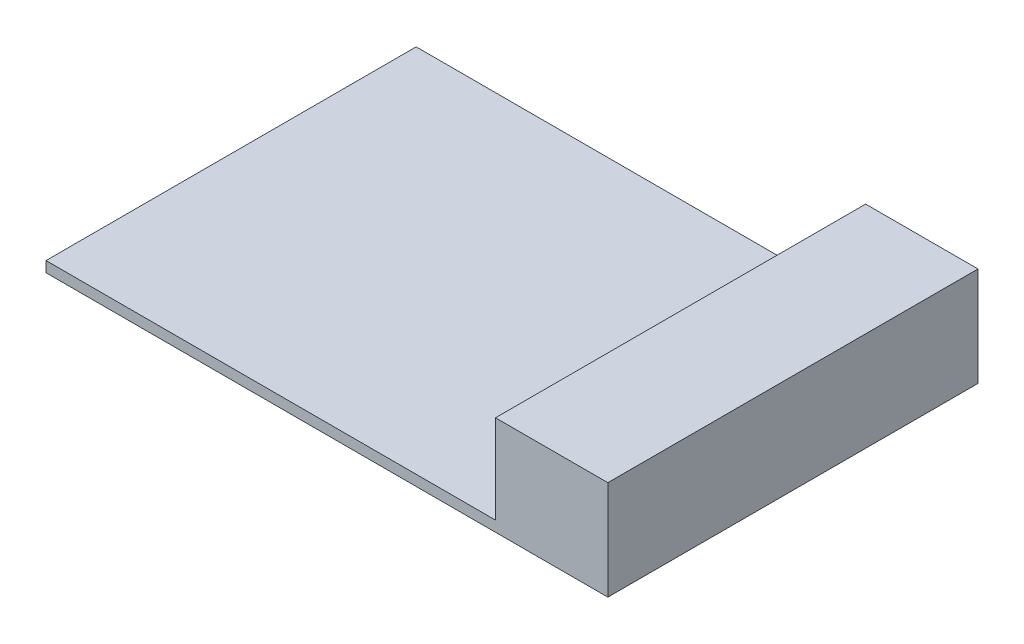
ISO-10303-21;
HEADER;
FILE_DESCRIPTION(('STEP AP214'),'2;1');
FILE_NAME('part.step','',(''),(''),'','','');
FILE_SCHEMA(('AUTOMOTIVE_DESIGN { 1 0 10303 214 1 1 1 1 }'));
ENDSEC;
DATA;
#1=APPLICATION_CONTEXT('core data for automotive mechanical design processes');
#2=APPLICATION_PROTOCOL_DEFINITION('international standard','automotive_design',2000,#1);
#3=PRODUCT_CONTEXT('',#1,'mechanical');
#4=PRODUCT('Part','Part','',(#3));
#5=PRODUCT_RELATED_PRODUCT_CATEGORY('part','',(#4));
#6=PRODUCT_DEFINITION_FORMATION('','',#4);
#7=PRODUCT_DEFINITION_CONTEXT('part definition',#1,'design');
#8=PRODUCT_DEFINITION('design','',#6,#7);
#9=PRODUCT_DEFINITION_SHAPE('','',#8);
#10=(LENGTH_UNIT() NAMED_UNIT(*) SI_UNIT(.MILLI.,.METRE.));
#11=(NAMED_UNIT(*) PLANE_ANGLE_UNIT() SI_UNIT($,.RADIAN.));
#12=(NAMED_UNIT(*) SI_UNIT($,.STERADIAN.) SOLID_ANGLE_UNIT());
#13=UNCERTAINTY_MEASURE_WITH_UNIT(LENGTH_MEASURE(1.E-05),#10,'distance_accuracy_value','');
#14=(GEOMETRIC_REPRESENTATION_CONTEXT(3) GLOBAL_UNCERTAINTY_ASSIGNED_CONTEXT((#13)) GLOBAL_UNIT_ASSIGNED_CONTEXT((#10,
#11,#12)) REPRESENTATION_CONTEXT('',''));
#15=CARTESIAN_POINT('',(0.,0.,0.));
#16=DIRECTION('',(0.,0.,1.));
#17=DIRECTION('',(1.,0.,0.));
#18=AXIS2_PLACEMENT_3D('',#15,#16,#17);
#19=CARTESIAN_POINT('',(0.,1.6,0.));
#20=DIRECTION('',(0.,1.,0.));
#21=DIRECTION('',(0.,0.,1.));
#22=AXIS2_PLACEMENT_3D('',#19,#20,#21);
#23=PLANE('',#22);
#24=DIRECTION('',(1.,0.,0.));
#25=VECTOR('',#24,1.);
#26=CARTESIAN_POINT('',(-42.5,1.6,28.));
#27=LINE('',#26,#25);
#28=CARTESIAN_POINT('',(-42.5,1.6,28.));
#29=VERTEX_POINT('',#28);
#30=CARTESIAN_POINT('',(25.5,1.6,28.));
#31=VERTEX_POINT('',#30);
#32=EDGE_CURVE('E117',#29,#31,#27,.T.);
#33=ORIENTED_EDGE('',*,*,#32,.T.);
#34=DIRECTION('',(0.,0.,-1.));
#35=VECTOR('',#34,1.);
#36=CARTESIAN_POINT('',(25.5,1.6,0.));
#37=LINE('',#36,#35);
#38=CARTESIAN_POINT('',(25.5,1.6,-28.));
#39=VERTEX_POINT('',#38);
#40=EDGE_CURVE('E11',#31,#39,#37,.T.);
#41=ORIENTED_EDGE('',*,*,#40,.T.);
#42=DIRECTION('',(-1.,0.,0.));
#43=VECTOR('',#42,1.);
#44=CARTESIAN_POINT('',(42.5,1.6,-28.));
#45=LINE('',#44,#43);
#46=CARTESIAN_POINT('',(-42.5,1.6,-28.));
#47=VERTEX_POINT('',#46);
#48=EDGE_CURVE('E62',#39,#47,#45,.T.);
#49=ORIENTED_EDGE('',*,*,#48,.T.);
#50=DIRECTION('',(0.,0.,1.));
#51=VECTOR('',#50,1.);
#52=CARTESIAN_POINT('',(-42.5,1.6,-28.));
#53=LINE('',#52,#51);
#54=EDGE_CURVE('E95',#47,#29,#53,.T.);
#55=ORIENTED_EDGE('',*,*,#54,.T.);
#56=EDGE_LOOP('',(#33,#41,#49,#55));
#57=FACE_BOUND('',#56,.T.);
#58=ADVANCED_FACE('F39',(#57),#23,.T.);
#59=CARTESIAN_POINT('',(-42.5,1.6,-28.));
#60=DIRECTION('',(1.,0.,0.));
#61=DIRECTION('',(0.,0.,-1.));
#62=AXIS2_PLACEMENT_3D('',#59,#60,#61);
#63=PLANE('',#62);
#64=DIRECTION('',(0.,0.,1.));
#65=VECTOR('',#64,1.);
#66=CARTESIAN_POINT('',(-42.5,0.,-28.));
#67=LINE('',#66,#65);
#68=CARTESIAN_POINT('',(-42.5,0.,-28.));
#69=VERTEX_POINT('',#68);
#70=CARTESIAN_POINT('',(-42.5,0.,28.));
#71=VERTEX_POINT('',#70);
#72=EDGE_CURVE('E98',#69,#71,#67,.T.);
#73=ORIENTED_EDGE('',*,*,#72,.T.);
#74=DIRECTION('',(0.,-1.,0.));
#75=VECTOR('',#74,1.);
#76=CARTESIAN_POINT('',(-42.5,1.6,28.));
#77=LINE('',#76,#75);
#78=EDGE_CURVE('E50',#29,#71,#77,.T.);
#79=ORIENTED_EDGE('',*,*,#78,.F.);
#80=ORIENTED_EDGE('',*,*,#54,.F.);
#81=DIRECTION('',(0.,-1.,0.));
#82=VECTOR('',#81,1.);
#83=CARTESIAN_POINT('',(-42.5,1.6,-28.));
#84=LINE('',#83,#82);
#85=EDGE_CURVE('E85',#47,#69,#84,.T.);
#86=ORIENTED_EDGE('',*,*,#85,.T.);
#87=EDGE_LOOP('',(#73,#79,#80,#86));
#88=FACE_BOUND('',#87,.T.);
#89=ADVANCED_FACE('F41',(#88),#63,.F.);
#90=CARTESIAN_POINT('',(-42.5,1.6,28.));
#91=DIRECTION('',(0.,0.,-1.));
#92=DIRECTION('',(-1.,0.,0.));
#93=AXIS2_PLACEMENT_3D('',#90,#91,#92);
#94=PLANE('',#93);
#95=DIRECTION('',(0.,-1.,0.));
#96=VECTOR('',#95,1.);
#97=CARTESIAN_POINT('',(42.5,1.6,28.));
#98=LINE('',#97,#96);
#99=CARTESIAN_POINT('',(42.5,15.,28.));
#100=VERTEX_POINT('',#99);
#101=CARTESIAN_POINT('',(42.5,0.,28.));
#102=VERTEX_POINT('',#101);
#103=EDGE_CURVE('E114',#100,#102,#98,.T.);
#104=ORIENTED_EDGE('',*,*,#103,.F.);
#105=DIRECTION('',(1.,0.,0.));
#106=VECTOR('',#105,1.);
#107=CARTESIAN_POINT('',(25.5,15.,28.));
#108=LINE('',#107,#106);
#109=CARTESIAN_POINT('',(25.5,15.,28.));
#110=VERTEX_POINT('',#109);
#111=EDGE_CURVE('E133',#110,#100,#108,.T.);
#112=ORIENTED_EDGE('',*,*,#111,.F.);
#113=DIRECTION('',(0.,-1.,0.));
#114=VECTOR('',#113,1.);
#115=CARTESIAN_POINT('',(25.5,15.,28.));
#116=LINE('',#115,#114);
#117=EDGE_CURVE('E102',#110,#31,#116,.T.);
#118=ORIENTED_EDGE('',*,*,#117,.T.);
#119=ORIENTED_EDGE('',*,*,#32,.F.);
#120=ORIENTED_EDGE('',*,*,#78,.T.);
#121=DIRECTION('',(1.,0.,0.));
#122=VECTOR('',#121,1.);
#123=CARTESIAN_POINT('',(-42.5,0.,28.));
#124=LINE('',#123,#122);
#125=EDGE_CURVE('E101',#71,#102,#124,.T.);
#126=ORIENTED_EDGE('',*,*,#125,.T.);
#127=EDGE_LOOP('',(#104,#112,#118,#119,#120,#126));
#128=FACE_BOUND('',#127,.T.);
#129=ADVANCED_FACE('F120',(#128),#94,.F.);
#130=CARTESIAN_POINT('',(42.5,1.6,28.));
#131=DIRECTION('',(-1.,0.,0.));
#132=DIRECTION('',(0.,0.,1.));
#133=AXIS2_PLACEMENT_3D('',#130,#131,#132);
#134=PLANE('',#133);
#135=DIRECTION('',(0.,0.,-1.));
#136=VECTOR('',#135,1.);
#137=CARTESIAN_POINT('',(42.5,0.,28.));
#138=LINE('',#137,#136);
#139=CARTESIAN_POINT('',(42.5,0.,-28.));
#140=VERTEX_POINT('',#139);
#141=EDGE_CURVE('E93',#102,#140,#138,.T.);
#142=ORIENTED_EDGE('',*,*,#141,.T.);
#143=DIRECTION('',(0.,-1.,0.));
#144=VECTOR('',#143,1.);
#145=CARTESIAN_POINT('',(42.5,1.6,-28.));
#146=LINE('',#145,#144);
#147=CARTESIAN_POINT('',(42.5,15.,-28.));
#148=VERTEX_POINT('',#147);
#149=EDGE_CURVE('E86',#148,#140,#146,.T.);
#150=ORIENTED_EDGE('',*,*,#149,.F.);
#151=DIRECTION('',(0.,0.,-1.));
#152=VECTOR('',#151,1.);
#153=CARTESIAN_POINT('',(42.5,15.,28.));
#154=LINE('',#153,#152);
#155=EDGE_CURVE('E126',#100,#148,#154,.T.);
#156=ORIENTED_EDGE('',*,*,#155,.F.);
#157=ORIENTED_EDGE('',*,*,#103,.T.);
#158=EDGE_LOOP('',(#142,#150,#156,#157));
#159=FACE_BOUND('',#158,.T.);
#160=ADVANCED_FACE('F147',(#159),#134,.F.);
#161=CARTESIAN_POINT('',(42.5,1.6,-28.));
#162=DIRECTION('',(0.,0.,1.));
#163=DIRECTION('',(1.,0.,0.));
#164=AXIS2_PLACEMENT_3D('',#161,#162,#163);
#165=PLANE('',#164);
#166=ORIENTED_EDGE('',*,*,#48,.F.);
#167=DIRECTION('',(0.,-1.,0.));
#168=VECTOR('',#167,1.);
#169=CARTESIAN_POINT('',(25.5,15.,-28.));
#170=LINE('',#169,#168);
#171=CARTESIAN_POINT('',(25.5,15.,-28.));
#172=VERTEX_POINT('',#171);
#173=EDGE_CURVE('E53',#172,#39,#170,.T.);
#174=ORIENTED_EDGE('',*,*,#173,.F.);
#175=DIRECTION('',(-1.,0.,0.));
#176=VECTOR('',#175,1.);
#177=CARTESIAN_POINT('',(42.5,15.,-28.));
#178=LINE('',#177,#176);
#179=EDGE_CURVE('E123',#148,#172,#178,.T.);
#180=ORIENTED_EDGE('',*,*,#179,.F.);
#181=ORIENTED_EDGE('',*,*,#149,.T.);
#182=DIRECTION('',(-1.,0.,0.));
#183=VECTOR('',#182,1.);
#184=CARTESIAN_POINT('',(42.5,0.,-28.));
#185=LINE('',#184,#183);
#186=EDGE_CURVE('E83',#140,#69,#185,.T.);
#187=ORIENTED_EDGE('',*,*,#186,.T.);
#188=ORIENTED_EDGE('',*,*,#85,.F.);
#189=EDGE_LOOP('',(#166,#174,#180,#181,#187,#188));
#190=FACE_BOUND('',#189,.T.);
#191=ADVANCED_FACE('F81',(#190),#165,.F.);
#192=CARTESIAN_POINT('',(0.,0.,0.));
#193=DIRECTION('',(0.,1.,0.));
#194=DIRECTION('',(0.,0.,1.));
#195=AXIS2_PLACEMENT_3D('',#192,#193,#194);
#196=PLANE('',#195);
#197=ORIENTED_EDGE('',*,*,#72,.F.);
#198=ORIENTED_EDGE('',*,*,#186,.F.);
#199=ORIENTED_EDGE('',*,*,#141,.F.);
#200=ORIENTED_EDGE('',*,*,#125,.F.);
#201=EDGE_LOOP('',(#197,#198,#199,#200));
#202=FACE_BOUND('',#201,.T.);
#203=ADVANCED_FACE('F99',(#202),#196,.F.);
#204=CARTESIAN_POINT('',(25.5,15.,-28.));
#205=DIRECTION('',(1.,0.,0.));
#206=DIRECTION('',(0.,0.,-1.));
#207=AXIS2_PLACEMENT_3D('',#204,#205,#206);
#208=PLANE('',#207);
#209=ORIENTED_EDGE('',*,*,#40,.F.);
#210=ORIENTED_EDGE('',*,*,#117,.F.);
#211=DIRECTION('',(0.,0.,1.));
#212=VECTOR('',#211,1.);
#213=CARTESIAN_POINT('',(25.5,15.,-28.));
#214=LINE('',#213,#212);
#215=EDGE_CURVE('E135',#172,#110,#214,.T.);
#216=ORIENTED_EDGE('',*,*,#215,.F.);
#217=ORIENTED_EDGE('',*,*,#173,.T.);
#218=EDGE_LOOP('',(#209,#210,#216,#217));
#219=FACE_BOUND('',#218,.T.);
#220=ADVANCED_FACE('F143',(#219),#208,.F.);
#221=CARTESIAN_POINT('',(0.,15.,0.));
#222=DIRECTION('',(0.,1.,0.));
#223=DIRECTION('',(0.,0.,1.));
#224=AXIS2_PLACEMENT_3D('',#221,#222,#223);
#225=PLANE('',#224);
#226=ORIENTED_EDGE('',*,*,#215,.T.);
#227=ORIENTED_EDGE('',*,*,#111,.T.);
#228=ORIENTED_EDGE('',*,*,#155,.T.);
#229=ORIENTED_EDGE('',*,*,#179,.T.);
#230=EDGE_LOOP('',(#226,#227,#228,#229));
#231=FACE_BOUND('',#230,.T.);
#232=ADVANCED_FACE('F136',(#231),#225,.T.);
#233=CLOSED_SHELL('',(#58,#89,#129,#160,#191,#203,#220,#232));
#234=MANIFOLD_SOLID_BREP('B2',#233);
#235=ADVANCED_BREP_SHAPE_REPRESENTATION('',(#18,#234),#14);
#236=SHAPE_DEFINITION_REPRESENTATION(#9,#235);
ENDSEC;
END-ISO-10303-21;
